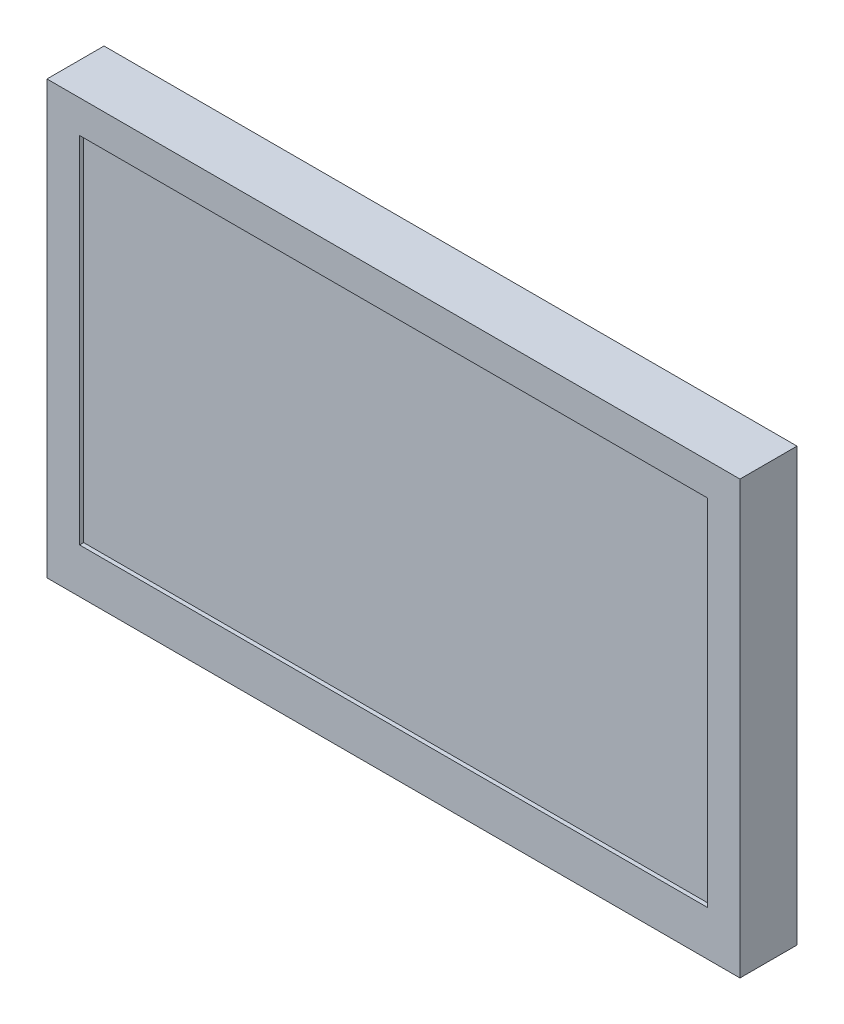
ISO-10303-21;
HEADER;
FILE_DESCRIPTION(('STEP AP214'),'2;1');
FILE_NAME('part.step','',(''),(''),'','','');
FILE_SCHEMA(('AUTOMOTIVE_DESIGN { 1 0 10303 214 1 1 1 1 }'));
ENDSEC;
DATA;
#1=APPLICATION_CONTEXT('core data for automotive mechanical design processes');
#2=APPLICATION_PROTOCOL_DEFINITION('international standard','automotive_design',2000,#1);
#3=PRODUCT_CONTEXT('',#1,'mechanical');
#4=PRODUCT('Part','Part','',(#3));
#5=PRODUCT_RELATED_PRODUCT_CATEGORY('part','',(#4));
#6=PRODUCT_DEFINITION_FORMATION('','',#4);
#7=PRODUCT_DEFINITION_CONTEXT('part definition',#1,'design');
#8=PRODUCT_DEFINITION('design','',#6,#7);
#9=PRODUCT_DEFINITION_SHAPE('','',#8);
#10=(LENGTH_UNIT() NAMED_UNIT(*) SI_UNIT(.MILLI.,.METRE.));
#11=(NAMED_UNIT(*) PLANE_ANGLE_UNIT() SI_UNIT($,.RADIAN.));
#12=(NAMED_UNIT(*) SI_UNIT($,.STERADIAN.) SOLID_ANGLE_UNIT());
#13=UNCERTAINTY_MEASURE_WITH_UNIT(LENGTH_MEASURE(1.E-05),#10,'distance_accuracy_value','');
#14=(GEOMETRIC_REPRESENTATION_CONTEXT(3) GLOBAL_UNCERTAINTY_ASSIGNED_CONTEXT((#13)) GLOBAL_UNIT_ASSIGNED_CONTEXT((#10,
#11,#12)) REPRESENTATION_CONTEXT('',''));
#15=CARTESIAN_POINT('',(0.,0.,0.));
#16=DIRECTION('',(0.,0.,1.));
#17=DIRECTION('',(1.,0.,0.));
#18=AXIS2_PLACEMENT_3D('',#15,#16,#17);
#19=CARTESIAN_POINT('',(85.,-53.,-14.));
#20=DIRECTION('',(1.,0.,0.));
#21=DIRECTION('',(0.,0.,-1.));
#22=AXIS2_PLACEMENT_3D('',#19,#20,#21);
#23=PLANE('',#22);
#24=DIRECTION('',(0.,1.,0.));
#25=VECTOR('',#24,1.);
#26=CARTESIAN_POINT('',(85.,-53.,0.));
#27=LINE('',#26,#25);
#28=CARTESIAN_POINT('',(85.,-53.,0.));
#29=VERTEX_POINT('',#28);
#30=CARTESIAN_POINT('',(85.,53.,0.));
#31=VERTEX_POINT('',#30);
#32=EDGE_CURVE('E168',#29,#31,#27,.T.);
#33=ORIENTED_EDGE('',*,*,#32,.F.);
#34=DIRECTION('',(0.,0.,1.));
#35=VECTOR('',#34,1.);
#36=CARTESIAN_POINT('',(85.,-53.,-14.));
#37=LINE('',#36,#35);
#38=CARTESIAN_POINT('',(85.,-53.,-14.));
#39=VERTEX_POINT('',#38);
#40=EDGE_CURVE('E11',#39,#29,#37,.T.);
#41=ORIENTED_EDGE('',*,*,#40,.F.);
#42=DIRECTION('',(0.,1.,0.));
#43=VECTOR('',#42,1.);
#44=CARTESIAN_POINT('',(85.,-53.,-14.));
#45=LINE('',#44,#43);
#46=CARTESIAN_POINT('',(85.,53.,-14.));
#47=VERTEX_POINT('',#46);
#48=EDGE_CURVE('E171',#39,#47,#45,.T.);
#49=ORIENTED_EDGE('',*,*,#48,.T.);
#50=DIRECTION('',(0.,0.,1.));
#51=VECTOR('',#50,1.);
#52=CARTESIAN_POINT('',(85.,53.,-14.));
#53=LINE('',#52,#51);
#54=EDGE_CURVE('E39',#47,#31,#53,.T.);
#55=ORIENTED_EDGE('',*,*,#54,.T.);
#56=EDGE_LOOP('',(#33,#41,#49,#55));
#57=FACE_BOUND('',#56,.T.);
#58=ADVANCED_FACE('F36',(#57),#23,.T.);
#59=CARTESIAN_POINT('',(-85.,-53.,-14.));
#60=DIRECTION('',(0.,-1.,0.));
#61=DIRECTION('',(0.,0.,-1.));
#62=AXIS2_PLACEMENT_3D('',#59,#60,#61);
#63=PLANE('',#62);
#64=DIRECTION('',(1.,0.,0.));
#65=VECTOR('',#64,1.);
#66=CARTESIAN_POINT('',(-85.,-53.,0.));
#67=LINE('',#66,#65);
#68=CARTESIAN_POINT('',(-85.,-53.,0.));
#69=VERTEX_POINT('',#68);
#70=EDGE_CURVE('E174',#69,#29,#67,.T.);
#71=ORIENTED_EDGE('',*,*,#70,.F.);
#72=DIRECTION('',(0.,0.,1.));
#73=VECTOR('',#72,1.);
#74=CARTESIAN_POINT('',(-85.,-53.,-14.));
#75=LINE('',#74,#73);
#76=CARTESIAN_POINT('',(-85.,-53.,-14.));
#77=VERTEX_POINT('',#76);
#78=EDGE_CURVE('E44',#77,#69,#75,.T.);
#79=ORIENTED_EDGE('',*,*,#78,.F.);
#80=DIRECTION('',(1.,0.,0.));
#81=VECTOR('',#80,1.);
#82=CARTESIAN_POINT('',(-85.,-53.,-14.));
#83=LINE('',#82,#81);
#84=EDGE_CURVE('E179',#77,#39,#83,.T.);
#85=ORIENTED_EDGE('',*,*,#84,.T.);
#86=ORIENTED_EDGE('',*,*,#40,.T.);
#87=EDGE_LOOP('',(#71,#79,#85,#86));
#88=FACE_BOUND('',#87,.T.);
#89=ADVANCED_FACE('F196',(#88),#63,.T.);
#90=CARTESIAN_POINT('',(-85.,-53.,-14.));
#91=DIRECTION('',(-1.,0.,0.));
#92=DIRECTION('',(0.,0.,1.));
#93=AXIS2_PLACEMENT_3D('',#90,#91,#92);
#94=PLANE('',#93);
#95=DIRECTION('',(0.,-1.,0.));
#96=VECTOR('',#95,1.);
#97=CARTESIAN_POINT('',(-85.,-53.,0.));
#98=LINE('',#97,#96);
#99=CARTESIAN_POINT('',(-85.,53.,0.));
#100=VERTEX_POINT('',#99);
#101=EDGE_CURVE('E186',#100,#69,#98,.T.);
#102=ORIENTED_EDGE('',*,*,#101,.F.);
#103=DIRECTION('',(0.,0.,1.));
#104=VECTOR('',#103,1.);
#105=CARTESIAN_POINT('',(-85.,53.,-14.));
#106=LINE('',#105,#104);
#107=CARTESIAN_POINT('',(-85.,53.,-14.));
#108=VERTEX_POINT('',#107);
#109=EDGE_CURVE('E191',#108,#100,#106,.T.);
#110=ORIENTED_EDGE('',*,*,#109,.F.);
#111=DIRECTION('',(0.,-1.,0.));
#112=VECTOR('',#111,1.);
#113=CARTESIAN_POINT('',(-85.,-53.,-14.));
#114=LINE('',#113,#112);
#115=EDGE_CURVE('E176',#108,#77,#114,.T.);
#116=ORIENTED_EDGE('',*,*,#115,.T.);
#117=ORIENTED_EDGE('',*,*,#78,.T.);
#118=EDGE_LOOP('',(#102,#110,#116,#117));
#119=FACE_BOUND('',#118,.T.);
#120=ADVANCED_FACE('F200',(#119),#94,.T.);
#121=CARTESIAN_POINT('',(-85.,53.,-14.));
#122=DIRECTION('',(0.,1.,0.));
#123=DIRECTION('',(0.,0.,1.));
#124=AXIS2_PLACEMENT_3D('',#121,#122,#123);
#125=PLANE('',#124);
#126=DIRECTION('',(-1.,0.,0.));
#127=VECTOR('',#126,1.);
#128=CARTESIAN_POINT('',(-85.,53.,0.));
#129=LINE('',#128,#127);
#130=EDGE_CURVE('E183',#31,#100,#129,.T.);
#131=ORIENTED_EDGE('',*,*,#130,.F.);
#132=ORIENTED_EDGE('',*,*,#54,.F.);
#133=DIRECTION('',(-1.,0.,0.));
#134=VECTOR('',#133,1.);
#135=CARTESIAN_POINT('',(-85.,53.,-14.));
#136=LINE('',#135,#134);
#137=EDGE_CURVE('E173',#47,#108,#136,.T.);
#138=ORIENTED_EDGE('',*,*,#137,.T.);
#139=ORIENTED_EDGE('',*,*,#109,.T.);
#140=EDGE_LOOP('',(#131,#132,#138,#139));
#141=FACE_BOUND('',#140,.T.);
#142=ADVANCED_FACE('F193',(#141),#125,.T.);
#143=CARTESIAN_POINT('',(0.,0.,-14.));
#144=DIRECTION('',(0.,0.,-1.));
#145=DIRECTION('',(-1.,0.,0.));
#146=AXIS2_PLACEMENT_3D('',#143,#144,#145);
#147=PLANE('',#146);
#148=CARTESIAN_POINT('',(-37.5000000000008,-37.5,-14.));
#149=DIRECTION('',(0.,0.,-1.));
#150=DIRECTION('',(-1.,0.,0.));
#151=AXIS2_PLACEMENT_3D('',#148,#149,#150);
#152=CIRCLE('',#151,2.);
#153=CARTESIAN_POINT('',(-39.5000000000008,-37.5,-14.));
#154=VERTEX_POINT('',#153);
#155=EDGE_CURVE('E143',#154,#154,#152,.T.);
#156=ORIENTED_EDGE('',*,*,#155,.F.);
#157=EDGE_LOOP('',(#156));
#158=FACE_BOUND('',#157,.T.);
#159=CARTESIAN_POINT('',(37.4999999999992,-37.5000000000005,-14.));
#160=DIRECTION('',(0.,0.,-1.));
#161=DIRECTION('',(-1.,0.,0.));
#162=AXIS2_PLACEMENT_3D('',#159,#160,#161);
#163=CIRCLE('',#162,2.);
#164=CARTESIAN_POINT('',(35.4999999999992,-37.5000000000005,-14.));
#165=VERTEX_POINT('',#164);
#166=EDGE_CURVE('E157',#165,#165,#163,.T.);
#167=ORIENTED_EDGE('',*,*,#166,.F.);
#168=EDGE_LOOP('',(#167));
#169=FACE_BOUND('',#168,.T.);
#170=CARTESIAN_POINT('',(37.5,37.4999999999995,-14.));
#171=DIRECTION('',(0.,0.,-1.));
#172=DIRECTION('',(-1.,0.,0.));
#173=AXIS2_PLACEMENT_3D('',#170,#171,#172);
#174=CIRCLE('',#173,2.);
#175=CARTESIAN_POINT('',(35.5,37.4999999999995,-14.));
#176=VERTEX_POINT('',#175);
#177=EDGE_CURVE('E151',#176,#176,#174,.T.);
#178=ORIENTED_EDGE('',*,*,#177,.F.);
#179=EDGE_LOOP('',(#178));
#180=FACE_BOUND('',#179,.T.);
#181=CARTESIAN_POINT('',(-37.5,37.5,-14.));
#182=DIRECTION('',(0.,0.,-1.));
#183=DIRECTION('',(-1.,0.,0.));
#184=AXIS2_PLACEMENT_3D('',#181,#182,#183);
#185=CIRCLE('',#184,2.);
#186=CARTESIAN_POINT('',(-39.5,37.5,-14.));
#187=VERTEX_POINT('',#186);
#188=EDGE_CURVE('E150',#187,#187,#185,.T.);
#189=ORIENTED_EDGE('',*,*,#188,.F.);
#190=EDGE_LOOP('',(#189));
#191=FACE_BOUND('',#190,.T.);
#192=ORIENTED_EDGE('',*,*,#48,.F.);
#193=ORIENTED_EDGE('',*,*,#84,.F.);
#194=ORIENTED_EDGE('',*,*,#115,.F.);
#195=ORIENTED_EDGE('',*,*,#137,.F.);
#196=EDGE_LOOP('',(#192,#193,#194,#195));
#197=FACE_BOUND('',#196,.T.);
#198=ADVANCED_FACE('F202',(#158,#169,#180,#191,#197),#147,.T.);
#199=CARTESIAN_POINT('',(0.,0.,0.));
#200=DIRECTION('',(0.,0.,-1.));
#201=DIRECTION('',(-1.,0.,0.));
#202=AXIS2_PLACEMENT_3D('',#199,#200,#201);
#203=PLANE('',#202);
#204=DIRECTION('',(-1.,0.,0.));
#205=VECTOR('',#204,1.);
#206=CARTESIAN_POINT('',(-77.,45.,0.));
#207=LINE('',#206,#205);
#208=CARTESIAN_POINT('',(77.,45.,0.));
#209=VERTEX_POINT('',#208);
#210=CARTESIAN_POINT('',(-77.,45.,0.));
#211=VERTEX_POINT('',#210);
#212=EDGE_CURVE('E137',#209,#211,#207,.T.);
#213=ORIENTED_EDGE('',*,*,#212,.F.);
#214=DIRECTION('',(0.,1.,0.));
#215=VECTOR('',#214,1.);
#216=CARTESIAN_POINT('',(77.,-42.,0.));
#217=LINE('',#216,#215);
#218=CARTESIAN_POINT('',(77.,-42.,0.));
#219=VERTEX_POINT('',#218);
#220=EDGE_CURVE('E52',#219,#209,#217,.T.);
#221=ORIENTED_EDGE('',*,*,#220,.F.);
#222=DIRECTION('',(1.,0.,0.));
#223=VECTOR('',#222,1.);
#224=CARTESIAN_POINT('',(-77.,-42.,0.));
#225=LINE('',#224,#223);
#226=CARTESIAN_POINT('',(-77.,-42.,0.));
#227=VERTEX_POINT('',#226);
#228=EDGE_CURVE('E128',#227,#219,#225,.T.);
#229=ORIENTED_EDGE('',*,*,#228,.F.);
#230=DIRECTION('',(0.,-1.,0.));
#231=VECTOR('',#230,1.);
#232=CARTESIAN_POINT('',(-77.,-42.,0.));
#233=LINE('',#232,#231);
#234=EDGE_CURVE('E131',#211,#227,#233,.T.);
#235=ORIENTED_EDGE('',*,*,#234,.F.);
#236=EDGE_LOOP('',(#213,#221,#229,#235));
#237=FACE_BOUND('',#236,.T.);
#238=ORIENTED_EDGE('',*,*,#32,.T.);
#239=ORIENTED_EDGE('',*,*,#130,.T.);
#240=ORIENTED_EDGE('',*,*,#101,.T.);
#241=ORIENTED_EDGE('',*,*,#70,.T.);
#242=EDGE_LOOP('',(#238,#239,#240,#241));
#243=FACE_BOUND('',#242,.T.);
#244=ADVANCED_FACE('F195',(#237,#243),#203,.F.);
#245=CARTESIAN_POINT('',(-37.5,37.5,-9.));
#246=DIRECTION('',(0.,0.,-1.));
#247=DIRECTION('',(-1.,0.,0.));
#248=AXIS2_PLACEMENT_3D('',#245,#246,#247);
#249=CYLINDRICAL_SURFACE('',#248,2.);
#250=CARTESIAN_POINT('',(-37.5,37.5,-9.));
#251=DIRECTION('',(0.,0.,-1.));
#252=DIRECTION('',(-1.,0.,0.));
#253=AXIS2_PLACEMENT_3D('',#250,#251,#252);
#254=CIRCLE('',#253,2.);
#255=CARTESIAN_POINT('',(-39.5,37.5,-9.));
#256=VERTEX_POINT('',#255);
#257=EDGE_CURVE('E165',#256,#256,#254,.T.);
#258=ORIENTED_EDGE('',*,*,#257,.F.);
#259=EDGE_LOOP('',(#258));
#260=FACE_BOUND('',#259,.T.);
#261=ORIENTED_EDGE('',*,*,#188,.T.);
#262=EDGE_LOOP('',(#261));
#263=FACE_BOUND('',#262,.T.);
#264=ADVANCED_FACE('F210',(#260,#263),#249,.F.);
#265=CARTESIAN_POINT('',(-37.5,37.5,-9.));
#266=DIRECTION('',(0.,0.,-1.));
#267=DIRECTION('',(-1.,0.,0.));
#268=AXIS2_PLACEMENT_3D('',#265,#266,#267);
#269=PLANE('',#268);
#270=ORIENTED_EDGE('',*,*,#257,.T.);
#271=EDGE_LOOP('',(#270));
#272=FACE_BOUND('',#271,.T.);
#273=ADVANCED_FACE('F334',(#272),#269,.T.);
#274=CARTESIAN_POINT('',(37.5,37.4999999999995,-9.));
#275=DIRECTION('',(0.,0.,-1.));
#276=DIRECTION('',(-1.,0.,0.));
#277=AXIS2_PLACEMENT_3D('',#274,#275,#276);
#278=CYLINDRICAL_SURFACE('',#277,2.);
#279=CARTESIAN_POINT('',(37.5,37.4999999999995,-9.));
#280=DIRECTION('',(0.,0.,-1.));
#281=DIRECTION('',(-1.,0.,0.));
#282=AXIS2_PLACEMENT_3D('',#279,#280,#281);
#283=CIRCLE('',#282,2.);
#284=CARTESIAN_POINT('',(35.5,37.4999999999995,-9.));
#285=VERTEX_POINT('',#284);
#286=EDGE_CURVE('E147',#285,#285,#283,.T.);
#287=ORIENTED_EDGE('',*,*,#286,.F.);
#288=EDGE_LOOP('',(#287));
#289=FACE_BOUND('',#288,.T.);
#290=ORIENTED_EDGE('',*,*,#177,.T.);
#291=EDGE_LOOP('',(#290));
#292=FACE_BOUND('',#291,.T.);
#293=ADVANCED_FACE('F326',(#289,#292),#278,.F.);
#294=CARTESIAN_POINT('',(37.5,37.4999999999995,-9.));
#295=DIRECTION('',(0.,0.,-1.));
#296=DIRECTION('',(-1.,0.,0.));
#297=AXIS2_PLACEMENT_3D('',#294,#295,#296);
#298=PLANE('',#297);
#299=ORIENTED_EDGE('',*,*,#286,.T.);
#300=EDGE_LOOP('',(#299));
#301=FACE_BOUND('',#300,.T.);
#302=ADVANCED_FACE('F318',(#301),#298,.T.);
#303=CARTESIAN_POINT('',(37.4999999999992,-37.5000000000005,-9.));
#304=DIRECTION('',(0.,0.,-1.));
#305=DIRECTION('',(-1.,0.,0.));
#306=AXIS2_PLACEMENT_3D('',#303,#304,#305);
#307=CYLINDRICAL_SURFACE('',#306,2.);
#308=CARTESIAN_POINT('',(37.4999999999992,-37.5000000000005,-9.));
#309=DIRECTION('',(0.,0.,-1.));
#310=DIRECTION('',(-1.,0.,0.));
#311=AXIS2_PLACEMENT_3D('',#308,#309,#310);
#312=CIRCLE('',#311,2.);
#313=CARTESIAN_POINT('',(35.4999999999992,-37.5000000000005,-9.));
#314=VERTEX_POINT('',#313);
#315=EDGE_CURVE('E154',#314,#314,#312,.T.);
#316=ORIENTED_EDGE('',*,*,#315,.F.);
#317=EDGE_LOOP('',(#316));
#318=FACE_BOUND('',#317,.T.);
#319=ORIENTED_EDGE('',*,*,#166,.T.);
#320=EDGE_LOOP('',(#319));
#321=FACE_BOUND('',#320,.T.);
#322=ADVANCED_FACE('F310',(#318,#321),#307,.F.);
#323=CARTESIAN_POINT('',(37.4999999999992,-37.5000000000005,-9.));
#324=DIRECTION('',(0.,0.,-1.));
#325=DIRECTION('',(-1.,0.,0.));
#326=AXIS2_PLACEMENT_3D('',#323,#324,#325);
#327=PLANE('',#326);
#328=ORIENTED_EDGE('',*,*,#315,.T.);
#329=EDGE_LOOP('',(#328));
#330=FACE_BOUND('',#329,.T.);
#331=ADVANCED_FACE('F302',(#330),#327,.T.);
#332=CARTESIAN_POINT('',(-37.5000000000008,-37.5,-9.));
#333=DIRECTION('',(0.,0.,-1.));
#334=DIRECTION('',(-1.,0.,0.));
#335=AXIS2_PLACEMENT_3D('',#332,#333,#334);
#336=CYLINDRICAL_SURFACE('',#335,2.);
#337=CARTESIAN_POINT('',(-37.5000000000008,-37.5,-9.));
#338=DIRECTION('',(0.,0.,-1.));
#339=DIRECTION('',(-1.,0.,0.));
#340=AXIS2_PLACEMENT_3D('',#337,#338,#339);
#341=CIRCLE('',#340,2.);
#342=CARTESIAN_POINT('',(-39.5000000000008,-37.5,-9.));
#343=VERTEX_POINT('',#342);
#344=EDGE_CURVE('E160',#343,#343,#341,.T.);
#345=ORIENTED_EDGE('',*,*,#344,.F.);
#346=EDGE_LOOP('',(#345));
#347=FACE_BOUND('',#346,.T.);
#348=ORIENTED_EDGE('',*,*,#155,.T.);
#349=EDGE_LOOP('',(#348));
#350=FACE_BOUND('',#349,.T.);
#351=ADVANCED_FACE('F294',(#347,#350),#336,.F.);
#352=CARTESIAN_POINT('',(-37.5000000000008,-37.5,-9.));
#353=DIRECTION('',(0.,0.,-1.));
#354=DIRECTION('',(-1.,0.,0.));
#355=AXIS2_PLACEMENT_3D('',#352,#353,#354);
#356=PLANE('',#355);
#357=ORIENTED_EDGE('',*,*,#344,.T.);
#358=EDGE_LOOP('',(#357));
#359=FACE_BOUND('',#358,.T.);
#360=ADVANCED_FACE('F285',(#359),#356,.T.);
#361=CARTESIAN_POINT('',(77.,-42.,-1.));
#362=DIRECTION('',(1.,0.,0.));
#363=DIRECTION('',(0.,0.,-1.));
#364=AXIS2_PLACEMENT_3D('',#361,#362,#363);
#365=PLANE('',#364);
#366=ORIENTED_EDGE('',*,*,#220,.T.);
#367=DIRECTION('',(0.,0.,1.));
#368=VECTOR('',#367,1.);
#369=CARTESIAN_POINT('',(77.,45.,-1.));
#370=LINE('',#369,#368);
#371=CARTESIAN_POINT('',(77.,45.,-1.));
#372=VERTEX_POINT('',#371);
#373=EDGE_CURVE('E106',#372,#209,#370,.T.);
#374=ORIENTED_EDGE('',*,*,#373,.F.);
#375=DIRECTION('',(0.,1.,0.));
#376=VECTOR('',#375,1.);
#377=CARTESIAN_POINT('',(77.,-42.,-1.));
#378=LINE('',#377,#376);
#379=CARTESIAN_POINT('',(77.,-42.,-1.));
#380=VERTEX_POINT('',#379);
#381=EDGE_CURVE('E110',#380,#372,#378,.T.);
#382=ORIENTED_EDGE('',*,*,#381,.F.);
#383=DIRECTION('',(0.,0.,1.));
#384=VECTOR('',#383,1.);
#385=CARTESIAN_POINT('',(77.,-42.,-1.));
#386=LINE('',#385,#384);
#387=EDGE_CURVE('E141',#380,#219,#386,.T.);
#388=ORIENTED_EDGE('',*,*,#387,.T.);
#389=EDGE_LOOP('',(#366,#374,#382,#388));
#390=FACE_BOUND('',#389,.T.);
#391=ADVANCED_FACE('F108',(#390),#365,.F.);
#392=CARTESIAN_POINT('',(-77.,-42.,-1.));
#393=DIRECTION('',(0.,-1.,0.));
#394=DIRECTION('',(0.,0.,-1.));
#395=AXIS2_PLACEMENT_3D('',#392,#393,#394);
#396=PLANE('',#395);
#397=ORIENTED_EDGE('',*,*,#228,.T.);
#398=ORIENTED_EDGE('',*,*,#387,.F.);
#399=DIRECTION('',(1.,0.,0.));
#400=VECTOR('',#399,1.);
#401=CARTESIAN_POINT('',(-77.,-42.,-1.));
#402=LINE('',#401,#400);
#403=CARTESIAN_POINT('',(-77.,-42.,-1.));
#404=VERTEX_POINT('',#403);
#405=EDGE_CURVE('E116',#404,#380,#402,.T.);
#406=ORIENTED_EDGE('',*,*,#405,.F.);
#407=DIRECTION('',(0.,0.,1.));
#408=VECTOR('',#407,1.);
#409=CARTESIAN_POINT('',(-77.,-42.,-1.));
#410=LINE('',#409,#408);
#411=EDGE_CURVE('E144',#404,#227,#410,.T.);
#412=ORIENTED_EDGE('',*,*,#411,.T.);
#413=EDGE_LOOP('',(#397,#398,#406,#412));
#414=FACE_BOUND('',#413,.T.);
#415=ADVANCED_FACE('F257',(#414),#396,.F.);
#416=CARTESIAN_POINT('',(-77.,-42.,-1.));
#417=DIRECTION('',(-1.,0.,0.));
#418=DIRECTION('',(0.,0.,1.));
#419=AXIS2_PLACEMENT_3D('',#416,#417,#418);
#420=PLANE('',#419);
#421=ORIENTED_EDGE('',*,*,#234,.T.);
#422=ORIENTED_EDGE('',*,*,#411,.F.);
#423=DIRECTION('',(0.,-1.,0.));
#424=VECTOR('',#423,1.);
#425=CARTESIAN_POINT('',(-77.,-42.,-1.));
#426=LINE('',#425,#424);
#427=CARTESIAN_POINT('',(-77.,45.,-1.));
#428=VERTEX_POINT('',#427);
#429=EDGE_CURVE('E124',#428,#404,#426,.T.);
#430=ORIENTED_EDGE('',*,*,#429,.F.);
#431=DIRECTION('',(0.,0.,1.));
#432=VECTOR('',#431,1.);
#433=CARTESIAN_POINT('',(-77.,45.,-1.));
#434=LINE('',#433,#432);
#435=EDGE_CURVE('E115',#428,#211,#434,.T.);
#436=ORIENTED_EDGE('',*,*,#435,.T.);
#437=EDGE_LOOP('',(#421,#422,#430,#436));
#438=FACE_BOUND('',#437,.T.);
#439=ADVANCED_FACE('F252',(#438),#420,.F.);
#440=CARTESIAN_POINT('',(-77.,45.,-1.));
#441=DIRECTION('',(0.,1.,0.));
#442=DIRECTION('',(0.,0.,1.));
#443=AXIS2_PLACEMENT_3D('',#440,#441,#442);
#444=PLANE('',#443);
#445=ORIENTED_EDGE('',*,*,#212,.T.);
#446=ORIENTED_EDGE('',*,*,#435,.F.);
#447=DIRECTION('',(-1.,0.,0.));
#448=VECTOR('',#447,1.);
#449=CARTESIAN_POINT('',(-77.,45.,-1.));
#450=LINE('',#449,#448);
#451=EDGE_CURVE('E119',#372,#428,#450,.T.);
#452=ORIENTED_EDGE('',*,*,#451,.F.);
#453=ORIENTED_EDGE('',*,*,#373,.T.);
#454=EDGE_LOOP('',(#445,#446,#452,#453));
#455=FACE_BOUND('',#454,.T.);
#456=ADVANCED_FACE('F120',(#455),#444,.F.);
#457=CARTESIAN_POINT('',(0.,0.,-1.));
#458=DIRECTION('',(0.,0.,-1.));
#459=DIRECTION('',(-1.,0.,0.));
#460=AXIS2_PLACEMENT_3D('',#457,#458,#459);
#461=PLANE('',#460);
#462=ORIENTED_EDGE('',*,*,#381,.T.);
#463=ORIENTED_EDGE('',*,*,#451,.T.);
#464=ORIENTED_EDGE('',*,*,#429,.T.);
#465=ORIENTED_EDGE('',*,*,#405,.T.);
#466=EDGE_LOOP('',(#462,#463,#464,#465));
#467=FACE_BOUND('',#466,.T.);
#468=ADVANCED_FACE('F126',(#467),#461,.F.);
#469=CLOSED_SHELL('',(#58,#89,#120,#142,#198,#244,#264,#273,#293,#302,#322,#331,#351,#360,#391,
#415,#439,#456,#468));
#470=MANIFOLD_SOLID_BREP('B2',#469);
#471=ADVANCED_BREP_SHAPE_REPRESENTATION('',(#18,#470),#14);
#472=SHAPE_DEFINITION_REPRESENTATION(#9,#471);
ENDSEC;
END-ISO-10303-21;
